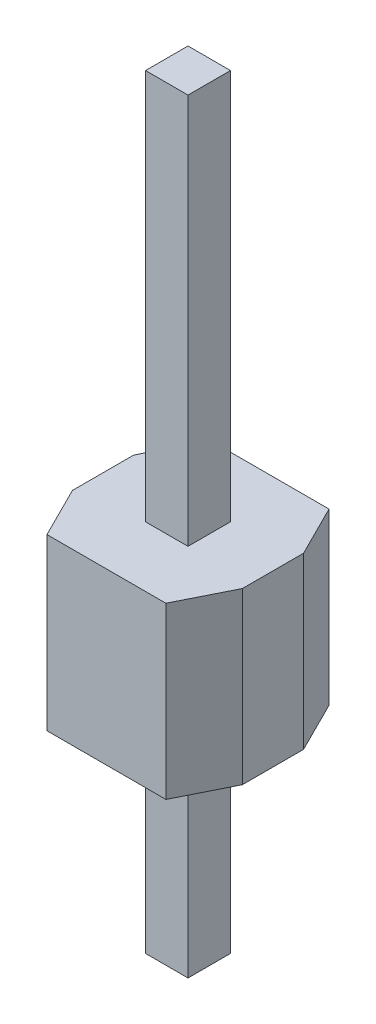
ISO-10303-21;
HEADER;
FILE_DESCRIPTION(('STEP AP214'),'2;1');
FILE_NAME('part.step','',(''),(''),'','','');
FILE_SCHEMA(('AUTOMOTIVE_DESIGN { 1 0 10303 214 1 1 1 1 }'));
ENDSEC;
DATA;
#1=APPLICATION_CONTEXT('core data for automotive mechanical design processes');
#2=APPLICATION_PROTOCOL_DEFINITION('international standard','automotive_design',2000,#1);
#3=PRODUCT_CONTEXT('',#1,'mechanical');
#4=PRODUCT('Part','Part','',(#3));
#5=PRODUCT_RELATED_PRODUCT_CATEGORY('part','',(#4));
#6=PRODUCT_DEFINITION_FORMATION('','',#4);
#7=PRODUCT_DEFINITION_CONTEXT('part definition',#1,'design');
#8=PRODUCT_DEFINITION('design','',#6,#7);
#9=PRODUCT_DEFINITION_SHAPE('','',#8);
#10=(LENGTH_UNIT() NAMED_UNIT(*) SI_UNIT(.MILLI.,.METRE.));
#11=(NAMED_UNIT(*) PLANE_ANGLE_UNIT() SI_UNIT($,.RADIAN.));
#12=(NAMED_UNIT(*) SI_UNIT($,.STERADIAN.) SOLID_ANGLE_UNIT());
#13=UNCERTAINTY_MEASURE_WITH_UNIT(LENGTH_MEASURE(1.E-05),#10,'distance_accuracy_value','');
#14=(GEOMETRIC_REPRESENTATION_CONTEXT(3) GLOBAL_UNCERTAINTY_ASSIGNED_CONTEXT((#13)) GLOBAL_UNIT_ASSIGNED_CONTEXT((#10,
#11,#12)) REPRESENTATION_CONTEXT('',''));
#15=CARTESIAN_POINT('',(0.,0.,0.));
#16=DIRECTION('',(0.,0.,1.));
#17=DIRECTION('',(1.,0.,0.));
#18=AXIS2_PLACEMENT_3D('',#15,#16,#17);
#19=CARTESIAN_POINT('',(0.,0.,0.));
#20=DIRECTION('',(0.,1.,0.));
#21=DIRECTION('',(0.,0.,1.));
#22=AXIS2_PLACEMENT_3D('',#19,#20,#21);
#23=PLANE('',#22);
#24=DIRECTION('',(1.,0.,0.));
#25=VECTOR('',#24,1.);
#26=CARTESIAN_POINT('',(0.381,0.,0.));
#27=LINE('',#26,#25);
#28=CARTESIAN_POINT('',(0.381,0.,0.));
#29=VERTEX_POINT('',#28);
#30=CARTESIAN_POINT('',(2.159,0.,0.));
#31=VERTEX_POINT('',#30);
#32=EDGE_CURVE('E203',#29,#31,#27,.T.);
#33=ORIENTED_EDGE('',*,*,#32,.F.);
#34=DIRECTION('',(0.447213595499958,0.,0.894427190999916));
#35=VECTOR('',#34,1.);
#36=CARTESIAN_POINT('',(0.381,0.,0.));
#37=LINE('',#36,#35);
#38=CARTESIAN_POINT('',(0.,0.,-0.762));
#39=VERTEX_POINT('',#38);
#40=EDGE_CURVE('E208',#39,#29,#37,.T.);
#41=ORIENTED_EDGE('',*,*,#40,.F.);
#42=DIRECTION('',(0.,0.,1.));
#43=VECTOR('',#42,1.);
#44=CARTESIAN_POINT('',(0.,0.,-0.762));
#45=LINE('',#44,#43);
#46=CARTESIAN_POINT('',(0.,0.,-1.6764));
#47=VERTEX_POINT('',#46);
#48=EDGE_CURVE('E235',#47,#39,#45,.T.);
#49=ORIENTED_EDGE('',*,*,#48,.F.);
#50=DIRECTION('',(-0.447213595499958,0.,0.894427190999916));
#51=VECTOR('',#50,1.);
#52=CARTESIAN_POINT('',(0.,0.,-1.6764));
#53=LINE('',#52,#51);
#54=CARTESIAN_POINT('',(0.381,0.,-2.4384));
#55=VERTEX_POINT('',#54);
#56=EDGE_CURVE('E233',#55,#47,#53,.T.);
#57=ORIENTED_EDGE('',*,*,#56,.F.);
#58=DIRECTION('',(-1.,0.,0.));
#59=VECTOR('',#58,1.);
#60=CARTESIAN_POINT('',(0.381,0.,-2.4384));
#61=LINE('',#60,#59);
#62=CARTESIAN_POINT('',(2.159,0.,-2.4384));
#63=VERTEX_POINT('',#62);
#64=EDGE_CURVE('E231',#63,#55,#61,.T.);
#65=ORIENTED_EDGE('',*,*,#64,.F.);
#66=DIRECTION('',(-0.447213595499958,0.,-0.894427190999916));
#67=VECTOR('',#66,1.);
#68=CARTESIAN_POINT('',(2.54,0.,-1.6764));
#69=LINE('',#68,#67);
#70=CARTESIAN_POINT('',(2.54,0.,-1.6764));
#71=VERTEX_POINT('',#70);
#72=EDGE_CURVE('E229',#71,#63,#69,.T.);
#73=ORIENTED_EDGE('',*,*,#72,.F.);
#74=DIRECTION('',(0.,0.,-1.));
#75=VECTOR('',#74,1.);
#76=CARTESIAN_POINT('',(2.54,0.,-0.762));
#77=LINE('',#76,#75);
#78=CARTESIAN_POINT('',(2.54,0.,-0.762));
#79=VERTEX_POINT('',#78);
#80=EDGE_CURVE('E227',#79,#71,#77,.T.);
#81=ORIENTED_EDGE('',*,*,#80,.F.);
#82=DIRECTION('',(0.447213595499958,0.,-0.894427190999916));
#83=VECTOR('',#82,1.);
#84=CARTESIAN_POINT('',(2.159,0.,0.));
#85=LINE('',#84,#83);
#86=EDGE_CURVE('E225',#31,#79,#85,.T.);
#87=ORIENTED_EDGE('',*,*,#86,.F.);
#88=EDGE_LOOP('',(#33,#41,#49,#57,#65,#73,#81,#87));
#89=FACE_BOUND('',#88,.T.);
#90=DIRECTION('',(0.,0.,1.));
#91=VECTOR('',#90,1.);
#92=CARTESIAN_POINT('',(1.5875,0.,-0.9017));
#93=LINE('',#92,#91);
#94=CARTESIAN_POINT('',(1.5875,0.,-1.5367));
#95=VERTEX_POINT('',#94);
#96=CARTESIAN_POINT('',(1.5875,0.,-0.9017));
#97=VERTEX_POINT('',#96);
#98=EDGE_CURVE('E168',#95,#97,#93,.T.);
#99=ORIENTED_EDGE('',*,*,#98,.F.);
#100=DIRECTION('',(1.,0.,0.));
#101=VECTOR('',#100,1.);
#102=CARTESIAN_POINT('',(1.5875,0.,-1.5367));
#103=LINE('',#102,#101);
#104=CARTESIAN_POINT('',(0.9525,0.,-1.5367));
#105=VERTEX_POINT('',#104);
#106=EDGE_CURVE('E165',#105,#95,#103,.T.);
#107=ORIENTED_EDGE('',*,*,#106,.F.);
#108=DIRECTION('',(0.,0.,-1.));
#109=VECTOR('',#108,1.);
#110=CARTESIAN_POINT('',(0.9525,0.,-0.9017));
#111=LINE('',#110,#109);
#112=CARTESIAN_POINT('',(0.9525,0.,-0.9017));
#113=VERTEX_POINT('',#112);
#114=EDGE_CURVE('E55',#113,#105,#111,.T.);
#115=ORIENTED_EDGE('',*,*,#114,.F.);
#116=DIRECTION('',(-1.,0.,0.));
#117=VECTOR('',#116,1.);
#118=CARTESIAN_POINT('',(1.5875,0.,-0.9017));
#119=LINE('',#118,#117);
#120=EDGE_CURVE('E50',#97,#113,#119,.T.);
#121=ORIENTED_EDGE('',*,*,#120,.F.);
#122=EDGE_LOOP('',(#99,#107,#115,#121));
#123=FACE_BOUND('',#122,.T.);
#124=ADVANCED_FACE('F35',(#89,#123),#23,.F.);
#125=CARTESIAN_POINT('',(0.,2.54,0.));
#126=DIRECTION('',(0.,1.,0.));
#127=DIRECTION('',(0.,0.,1.));
#128=AXIS2_PLACEMENT_3D('',#125,#126,#127);
#129=PLANE('',#128);
#130=DIRECTION('',(1.,0.,0.));
#131=VECTOR('',#130,1.);
#132=CARTESIAN_POINT('',(0.381,2.54,0.));
#133=LINE('',#132,#131);
#134=CARTESIAN_POINT('',(0.381,2.54,0.));
#135=VERTEX_POINT('',#134);
#136=CARTESIAN_POINT('',(2.159,2.54,0.));
#137=VERTEX_POINT('',#136);
#138=EDGE_CURVE('E204',#135,#137,#133,.T.);
#139=ORIENTED_EDGE('',*,*,#138,.T.);
#140=DIRECTION('',(0.447213595499958,0.,-0.894427190999916));
#141=VECTOR('',#140,1.);
#142=CARTESIAN_POINT('',(2.159,2.54,0.));
#143=LINE('',#142,#141);
#144=CARTESIAN_POINT('',(2.54,2.54,-0.762));
#145=VERTEX_POINT('',#144);
#146=EDGE_CURVE('E207',#137,#145,#143,.T.);
#147=ORIENTED_EDGE('',*,*,#146,.T.);
#148=DIRECTION('',(0.,0.,-1.));
#149=VECTOR('',#148,1.);
#150=CARTESIAN_POINT('',(2.54,2.54,-0.762));
#151=LINE('',#150,#149);
#152=CARTESIAN_POINT('',(2.54,2.54,-1.6764));
#153=VERTEX_POINT('',#152);
#154=EDGE_CURVE('E210',#145,#153,#151,.T.);
#155=ORIENTED_EDGE('',*,*,#154,.T.);
#156=DIRECTION('',(-0.447213595499958,0.,-0.894427190999916));
#157=VECTOR('',#156,1.);
#158=CARTESIAN_POINT('',(2.54,2.54,-1.6764));
#159=LINE('',#158,#157);
#160=CARTESIAN_POINT('',(2.159,2.54,-2.4384));
#161=VERTEX_POINT('',#160);
#162=EDGE_CURVE('E212',#153,#161,#159,.T.);
#163=ORIENTED_EDGE('',*,*,#162,.T.);
#164=DIRECTION('',(-1.,0.,0.));
#165=VECTOR('',#164,1.);
#166=CARTESIAN_POINT('',(0.381,2.54,-2.4384));
#167=LINE('',#166,#165);
#168=CARTESIAN_POINT('',(0.381,2.54,-2.4384));
#169=VERTEX_POINT('',#168);
#170=EDGE_CURVE('E214',#161,#169,#167,.T.);
#171=ORIENTED_EDGE('',*,*,#170,.T.);
#172=DIRECTION('',(-0.447213595499958,0.,0.894427190999916));
#173=VECTOR('',#172,1.);
#174=CARTESIAN_POINT('',(0.,2.54,-1.6764));
#175=LINE('',#174,#173);
#176=CARTESIAN_POINT('',(0.,2.54,-1.6764));
#177=VERTEX_POINT('',#176);
#178=EDGE_CURVE('E216',#169,#177,#175,.T.);
#179=ORIENTED_EDGE('',*,*,#178,.T.);
#180=DIRECTION('',(0.,0.,1.));
#181=VECTOR('',#180,1.);
#182=CARTESIAN_POINT('',(0.,2.54,-0.762));
#183=LINE('',#182,#181);
#184=CARTESIAN_POINT('',(0.,2.54,-0.762));
#185=VERTEX_POINT('',#184);
#186=EDGE_CURVE('E218',#177,#185,#183,.T.);
#187=ORIENTED_EDGE('',*,*,#186,.T.);
#188=DIRECTION('',(0.447213595499958,0.,0.894427190999916));
#189=VECTOR('',#188,1.);
#190=CARTESIAN_POINT('',(0.381,2.54,0.));
#191=LINE('',#190,#189);
#192=EDGE_CURVE('E220',#185,#135,#191,.T.);
#193=ORIENTED_EDGE('',*,*,#192,.T.);
#194=EDGE_LOOP('',(#139,#147,#155,#163,#171,#179,#187,#193));
#195=FACE_BOUND('',#194,.T.);
#196=DIRECTION('',(1.,0.,0.));
#197=VECTOR('',#196,1.);
#198=CARTESIAN_POINT('',(0.9525,2.54,-0.9017));
#199=LINE('',#198,#197);
#200=CARTESIAN_POINT('',(0.9525,2.54,-0.9017));
#201=VERTEX_POINT('',#200);
#202=CARTESIAN_POINT('',(1.5875,2.54,-0.9017));
#203=VERTEX_POINT('',#202);
#204=EDGE_CURVE('E172',#201,#203,#199,.T.);
#205=ORIENTED_EDGE('',*,*,#204,.F.);
#206=DIRECTION('',(0.,0.,1.));
#207=VECTOR('',#206,1.);
#208=CARTESIAN_POINT('',(0.9525,2.54,-1.5367));
#209=LINE('',#208,#207);
#210=CARTESIAN_POINT('',(0.9525,2.54,-1.5367));
#211=VERTEX_POINT('',#210);
#212=EDGE_CURVE('E169',#211,#201,#209,.T.);
#213=ORIENTED_EDGE('',*,*,#212,.F.);
#214=DIRECTION('',(-1.,0.,0.));
#215=VECTOR('',#214,1.);
#216=CARTESIAN_POINT('',(0.9525,2.54,-1.5367));
#217=LINE('',#216,#215);
#218=CARTESIAN_POINT('',(1.5875,2.54,-1.5367));
#219=VERTEX_POINT('',#218);
#220=EDGE_CURVE('E182',#219,#211,#217,.T.);
#221=ORIENTED_EDGE('',*,*,#220,.F.);
#222=DIRECTION('',(0.,0.,-1.));
#223=VECTOR('',#222,1.);
#224=CARTESIAN_POINT('',(1.5875,2.54,-1.5367));
#225=LINE('',#224,#223);
#226=EDGE_CURVE('E190',#203,#219,#225,.T.);
#227=ORIENTED_EDGE('',*,*,#226,.F.);
#228=EDGE_LOOP('',(#205,#213,#221,#227));
#229=FACE_BOUND('',#228,.T.);
#230=ADVANCED_FACE('F277',(#195,#229),#129,.T.);
#231=CARTESIAN_POINT('',(0.381,2.54,0.));
#232=DIRECTION('',(0.,0.,-1.));
#233=DIRECTION('',(-1.,0.,0.));
#234=AXIS2_PLACEMENT_3D('',#231,#232,#233);
#235=PLANE('',#234);
#236=ORIENTED_EDGE('',*,*,#32,.T.);
#237=DIRECTION('',(0.,-1.,0.));
#238=VECTOR('',#237,1.);
#239=CARTESIAN_POINT('',(2.159,2.54,0.));
#240=LINE('',#239,#238);
#241=EDGE_CURVE('E11',#137,#31,#240,.T.);
#242=ORIENTED_EDGE('',*,*,#241,.F.);
#243=ORIENTED_EDGE('',*,*,#138,.F.);
#244=DIRECTION('',(0.,-1.,0.));
#245=VECTOR('',#244,1.);
#246=CARTESIAN_POINT('',(0.381,2.54,0.));
#247=LINE('',#246,#245);
#248=EDGE_CURVE('E222',#135,#29,#247,.T.);
#249=ORIENTED_EDGE('',*,*,#248,.T.);
#250=EDGE_LOOP('',(#236,#242,#243,#249));
#251=FACE_BOUND('',#250,.T.);
#252=ADVANCED_FACE('F37',(#251),#235,.F.);
#253=CARTESIAN_POINT('',(2.159,2.54,0.));
#254=DIRECTION('',(-0.894427190999916,0.,-0.447213595499958));
#255=DIRECTION('',(-0.447213595499958,0.,0.894427190999916));
#256=AXIS2_PLACEMENT_3D('',#253,#254,#255);
#257=PLANE('',#256);
#258=ORIENTED_EDGE('',*,*,#86,.T.);
#259=DIRECTION('',(0.,-1.,0.));
#260=VECTOR('',#259,1.);
#261=CARTESIAN_POINT('',(2.54,2.54,-0.762));
#262=LINE('',#261,#260);
#263=EDGE_CURVE('E43',#145,#79,#262,.T.);
#264=ORIENTED_EDGE('',*,*,#263,.F.);
#265=ORIENTED_EDGE('',*,*,#146,.F.);
#266=ORIENTED_EDGE('',*,*,#241,.T.);
#267=EDGE_LOOP('',(#258,#264,#265,#266));
#268=FACE_BOUND('',#267,.T.);
#269=ADVANCED_FACE('F282',(#268),#257,.F.);
#270=CARTESIAN_POINT('',(2.54,2.54,-0.762));
#271=DIRECTION('',(-1.,0.,0.));
#272=DIRECTION('',(0.,0.,1.));
#273=AXIS2_PLACEMENT_3D('',#270,#271,#272);
#274=PLANE('',#273);
#275=ORIENTED_EDGE('',*,*,#80,.T.);
#276=DIRECTION('',(0.,-1.,0.));
#277=VECTOR('',#276,1.);
#278=CARTESIAN_POINT('',(2.54,2.54,-1.6764));
#279=LINE('',#278,#277);
#280=EDGE_CURVE('E252',#153,#71,#279,.T.);
#281=ORIENTED_EDGE('',*,*,#280,.F.);
#282=ORIENTED_EDGE('',*,*,#154,.F.);
#283=ORIENTED_EDGE('',*,*,#263,.T.);
#284=EDGE_LOOP('',(#275,#281,#282,#283));
#285=FACE_BOUND('',#284,.T.);
#286=ADVANCED_FACE('F259',(#285),#274,.F.);
#287=CARTESIAN_POINT('',(2.54,2.54,-1.6764));
#288=DIRECTION('',(-0.894427190999916,0.,0.447213595499958));
#289=DIRECTION('',(0.447213595499958,0.,0.894427190999916));
#290=AXIS2_PLACEMENT_3D('',#287,#288,#289);
#291=PLANE('',#290);
#292=ORIENTED_EDGE('',*,*,#72,.T.);
#293=DIRECTION('',(0.,-1.,0.));
#294=VECTOR('',#293,1.);
#295=CARTESIAN_POINT('',(2.159,2.54,-2.4384));
#296=LINE('',#295,#294);
#297=EDGE_CURVE('E249',#161,#63,#296,.T.);
#298=ORIENTED_EDGE('',*,*,#297,.F.);
#299=ORIENTED_EDGE('',*,*,#162,.F.);
#300=ORIENTED_EDGE('',*,*,#280,.T.);
#301=EDGE_LOOP('',(#292,#298,#299,#300));
#302=FACE_BOUND('',#301,.T.);
#303=ADVANCED_FACE('F269',(#302),#291,.F.);
#304=CARTESIAN_POINT('',(0.381,2.54,-2.4384));
#305=DIRECTION('',(0.,0.,1.));
#306=DIRECTION('',(1.,0.,0.));
#307=AXIS2_PLACEMENT_3D('',#304,#305,#306);
#308=PLANE('',#307);
#309=ORIENTED_EDGE('',*,*,#64,.T.);
#310=DIRECTION('',(0.,-1.,0.));
#311=VECTOR('',#310,1.);
#312=CARTESIAN_POINT('',(0.381,2.54,-2.4384));
#313=LINE('',#312,#311);
#314=EDGE_CURVE('E246',#169,#55,#313,.T.);
#315=ORIENTED_EDGE('',*,*,#314,.F.);
#316=ORIENTED_EDGE('',*,*,#170,.F.);
#317=ORIENTED_EDGE('',*,*,#297,.T.);
#318=EDGE_LOOP('',(#309,#315,#316,#317));
#319=FACE_BOUND('',#318,.T.);
#320=ADVANCED_FACE('F273',(#319),#308,.F.);
#321=CARTESIAN_POINT('',(0.,2.54,-1.6764));
#322=DIRECTION('',(0.894427190999916,0.,0.447213595499958));
#323=DIRECTION('',(0.447213595499958,0.,-0.894427190999916));
#324=AXIS2_PLACEMENT_3D('',#321,#322,#323);
#325=PLANE('',#324);
#326=ORIENTED_EDGE('',*,*,#56,.T.);
#327=DIRECTION('',(0.,-1.,0.));
#328=VECTOR('',#327,1.);
#329=CARTESIAN_POINT('',(0.,2.54,-1.6764));
#330=LINE('',#329,#328);
#331=EDGE_CURVE('E243',#177,#47,#330,.T.);
#332=ORIENTED_EDGE('',*,*,#331,.F.);
#333=ORIENTED_EDGE('',*,*,#178,.F.);
#334=ORIENTED_EDGE('',*,*,#314,.T.);
#335=EDGE_LOOP('',(#326,#332,#333,#334));
#336=FACE_BOUND('',#335,.T.);
#337=ADVANCED_FACE('F295',(#336),#325,.F.);
#338=CARTESIAN_POINT('',(0.,2.54,-0.762));
#339=DIRECTION('',(1.,0.,0.));
#340=DIRECTION('',(0.,0.,-1.));
#341=AXIS2_PLACEMENT_3D('',#338,#339,#340);
#342=PLANE('',#341);
#343=ORIENTED_EDGE('',*,*,#48,.T.);
#344=DIRECTION('',(0.,-1.,0.));
#345=VECTOR('',#344,1.);
#346=CARTESIAN_POINT('',(0.,2.54,-0.762));
#347=LINE('',#346,#345);
#348=EDGE_CURVE('E240',#185,#39,#347,.T.);
#349=ORIENTED_EDGE('',*,*,#348,.F.);
#350=ORIENTED_EDGE('',*,*,#186,.F.);
#351=ORIENTED_EDGE('',*,*,#331,.T.);
#352=EDGE_LOOP('',(#343,#349,#350,#351));
#353=FACE_BOUND('',#352,.T.);
#354=ADVANCED_FACE('F293',(#353),#342,.F.);
#355=CARTESIAN_POINT('',(0.381,2.54,0.));
#356=DIRECTION('',(0.894427190999916,0.,-0.447213595499958));
#357=DIRECTION('',(-0.447213595499958,0.,-0.894427190999916));
#358=AXIS2_PLACEMENT_3D('',#355,#356,#357);
#359=PLANE('',#358);
#360=ORIENTED_EDGE('',*,*,#40,.T.);
#361=ORIENTED_EDGE('',*,*,#248,.F.);
#362=ORIENTED_EDGE('',*,*,#192,.F.);
#363=ORIENTED_EDGE('',*,*,#348,.T.);
#364=EDGE_LOOP('',(#360,#361,#362,#363));
#365=FACE_BOUND('',#364,.T.);
#366=ADVANCED_FACE('F288',(#365),#359,.F.);
#367=CARTESIAN_POINT('',(0.9525,8.382,-1.5367));
#368=DIRECTION('',(1.,0.,0.));
#369=DIRECTION('',(0.,0.,-1.));
#370=AXIS2_PLACEMENT_3D('',#367,#368,#369);
#371=PLANE('',#370);
#372=ORIENTED_EDGE('',*,*,#212,.T.);
#373=DIRECTION('',(0.,-1.,0.));
#374=VECTOR('',#373,1.);
#375=CARTESIAN_POINT('',(0.9525,8.382,-0.9017));
#376=LINE('',#375,#374);
#377=CARTESIAN_POINT('',(0.9525,8.382,-0.9017));
#378=VERTEX_POINT('',#377);
#379=EDGE_CURVE('E201',#378,#201,#376,.T.);
#380=ORIENTED_EDGE('',*,*,#379,.F.);
#381=DIRECTION('',(0.,0.,1.));
#382=VECTOR('',#381,1.);
#383=CARTESIAN_POINT('',(0.9525,8.382,-1.5367));
#384=LINE('',#383,#382);
#385=CARTESIAN_POINT('',(0.9525,8.382,-1.5367));
#386=VERTEX_POINT('',#385);
#387=EDGE_CURVE('E178',#386,#378,#384,.T.);
#388=ORIENTED_EDGE('',*,*,#387,.F.);
#389=DIRECTION('',(0.,-1.,0.));
#390=VECTOR('',#389,1.);
#391=CARTESIAN_POINT('',(0.9525,8.382,-1.5367));
#392=LINE('',#391,#390);
#393=EDGE_CURVE('E187',#386,#211,#392,.T.);
#394=ORIENTED_EDGE('',*,*,#393,.T.);
#395=EDGE_LOOP('',(#372,#380,#388,#394));
#396=FACE_BOUND('',#395,.T.);
#397=ADVANCED_FACE('F313',(#396),#371,.F.);
#398=CARTESIAN_POINT('',(0.9525,8.382,-0.9017));
#399=DIRECTION('',(0.,0.,-1.));
#400=DIRECTION('',(-1.,0.,0.));
#401=AXIS2_PLACEMENT_3D('',#398,#399,#400);
#402=PLANE('',#401);
#403=ORIENTED_EDGE('',*,*,#204,.T.);
#404=DIRECTION('',(0.,-1.,0.));
#405=VECTOR('',#404,1.);
#406=CARTESIAN_POINT('',(1.5875,8.382,-0.9017));
#407=LINE('',#406,#405);
#408=CARTESIAN_POINT('',(1.5875,8.382,-0.9017));
#409=VERTEX_POINT('',#408);
#410=EDGE_CURVE('E198',#409,#203,#407,.T.);
#411=ORIENTED_EDGE('',*,*,#410,.F.);
#412=DIRECTION('',(1.,0.,0.));
#413=VECTOR('',#412,1.);
#414=CARTESIAN_POINT('',(0.9525,8.382,-0.9017));
#415=LINE('',#414,#413);
#416=EDGE_CURVE('E181',#378,#409,#415,.T.);
#417=ORIENTED_EDGE('',*,*,#416,.F.);
#418=ORIENTED_EDGE('',*,*,#379,.T.);
#419=EDGE_LOOP('',(#403,#411,#417,#418));
#420=FACE_BOUND('',#419,.T.);
#421=ADVANCED_FACE('F317',(#420),#402,.F.);
#422=CARTESIAN_POINT('',(1.5875,8.382,-1.5367));
#423=DIRECTION('',(-1.,0.,0.));
#424=DIRECTION('',(0.,0.,1.));
#425=AXIS2_PLACEMENT_3D('',#422,#423,#424);
#426=PLANE('',#425);
#427=ORIENTED_EDGE('',*,*,#226,.T.);
#428=DIRECTION('',(0.,-1.,0.));
#429=VECTOR('',#428,1.);
#430=CARTESIAN_POINT('',(1.5875,8.382,-1.5367));
#431=LINE('',#430,#429);
#432=CARTESIAN_POINT('',(1.5875,8.382,-1.5367));
#433=VERTEX_POINT('',#432);
#434=EDGE_CURVE('E196',#433,#219,#431,.T.);
#435=ORIENTED_EDGE('',*,*,#434,.F.);
#436=DIRECTION('',(0.,0.,-1.));
#437=VECTOR('',#436,1.);
#438=CARTESIAN_POINT('',(1.5875,8.382,-1.5367));
#439=LINE('',#438,#437);
#440=EDGE_CURVE('E184',#409,#433,#439,.T.);
#441=ORIENTED_EDGE('',*,*,#440,.F.);
#442=ORIENTED_EDGE('',*,*,#410,.T.);
#443=EDGE_LOOP('',(#427,#435,#441,#442));
#444=FACE_BOUND('',#443,.T.);
#445=ADVANCED_FACE('F322',(#444),#426,.F.);
#446=CARTESIAN_POINT('',(0.9525,8.382,-1.5367));
#447=DIRECTION('',(0.,0.,1.));
#448=DIRECTION('',(1.,0.,0.));
#449=AXIS2_PLACEMENT_3D('',#446,#447,#448);
#450=PLANE('',#449);
#451=ORIENTED_EDGE('',*,*,#220,.T.);
#452=ORIENTED_EDGE('',*,*,#393,.F.);
#453=DIRECTION('',(-1.,0.,0.));
#454=VECTOR('',#453,1.);
#455=CARTESIAN_POINT('',(0.9525,8.382,-1.5367));
#456=LINE('',#455,#454);
#457=EDGE_CURVE('E186',#433,#386,#456,.T.);
#458=ORIENTED_EDGE('',*,*,#457,.F.);
#459=ORIENTED_EDGE('',*,*,#434,.T.);
#460=EDGE_LOOP('',(#451,#452,#458,#459));
#461=FACE_BOUND('',#460,.T.);
#462=ADVANCED_FACE('F328',(#461),#450,.F.);
#463=CARTESIAN_POINT('',(0.,8.382,0.));
#464=DIRECTION('',(0.,1.,0.));
#465=DIRECTION('',(0.,0.,1.));
#466=AXIS2_PLACEMENT_3D('',#463,#464,#465);
#467=PLANE('',#466);
#468=ORIENTED_EDGE('',*,*,#387,.T.);
#469=ORIENTED_EDGE('',*,*,#416,.T.);
#470=ORIENTED_EDGE('',*,*,#440,.T.);
#471=ORIENTED_EDGE('',*,*,#457,.T.);
#472=EDGE_LOOP('',(#468,#469,#470,#471));
#473=FACE_BOUND('',#472,.T.);
#474=ADVANCED_FACE('F332',(#473),#467,.T.);
#475=CARTESIAN_POINT('',(1.5875,-3.048,-0.9017));
#476=DIRECTION('',(-1.,0.,0.));
#477=DIRECTION('',(0.,0.,1.));
#478=AXIS2_PLACEMENT_3D('',#475,#476,#477);
#479=PLANE('',#478);
#480=ORIENTED_EDGE('',*,*,#98,.T.);
#481=DIRECTION('',(0.,1.,0.));
#482=VECTOR('',#481,1.);
#483=CARTESIAN_POINT('',(1.5875,-3.048,-0.9017));
#484=LINE('',#483,#482);
#485=CARTESIAN_POINT('',(1.5875,-3.048,-0.9017));
#486=VERTEX_POINT('',#485);
#487=EDGE_CURVE('E149',#486,#97,#484,.T.);
#488=ORIENTED_EDGE('',*,*,#487,.F.);
#489=DIRECTION('',(0.,0.,1.));
#490=VECTOR('',#489,1.);
#491=CARTESIAN_POINT('',(1.5875,-3.048,-0.9017));
#492=LINE('',#491,#490);
#493=CARTESIAN_POINT('',(1.5875,-3.048,-1.5367));
#494=VERTEX_POINT('',#493);
#495=EDGE_CURVE('E156',#494,#486,#492,.T.);
#496=ORIENTED_EDGE('',*,*,#495,.F.);
#497=DIRECTION('',(0.,1.,0.));
#498=VECTOR('',#497,1.);
#499=CARTESIAN_POINT('',(1.5875,-3.048,-1.5367));
#500=LINE('',#499,#498);
#501=EDGE_CURVE('E490',#494,#95,#500,.T.);
#502=ORIENTED_EDGE('',*,*,#501,.T.);
#503=EDGE_LOOP('',(#480,#488,#496,#502));
#504=FACE_BOUND('',#503,.T.);
#505=ADVANCED_FACE('F167',(#504),#479,.F.);
#506=CARTESIAN_POINT('',(1.5875,-3.048,-0.9017));
#507=DIRECTION('',(0.,0.,-1.));
#508=DIRECTION('',(-1.,0.,0.));
#509=AXIS2_PLACEMENT_3D('',#506,#507,#508);
#510=PLANE('',#509);
#511=ORIENTED_EDGE('',*,*,#120,.T.);
#512=DIRECTION('',(0.,1.,0.));
#513=VECTOR('',#512,1.);
#514=CARTESIAN_POINT('',(0.9525,-3.048,-0.9017));
#515=LINE('',#514,#513);
#516=CARTESIAN_POINT('',(0.9525,-3.048,-0.9017));
#517=VERTEX_POINT('',#516);
#518=EDGE_CURVE('E152',#517,#113,#515,.T.);
#519=ORIENTED_EDGE('',*,*,#518,.F.);
#520=DIRECTION('',(-1.,0.,0.));
#521=VECTOR('',#520,1.);
#522=CARTESIAN_POINT('',(1.5875,-3.048,-0.9017));
#523=LINE('',#522,#521);
#524=EDGE_CURVE('E145',#486,#517,#523,.T.);
#525=ORIENTED_EDGE('',*,*,#524,.F.);
#526=ORIENTED_EDGE('',*,*,#487,.T.);
#527=EDGE_LOOP('',(#511,#519,#525,#526));
#528=FACE_BOUND('',#527,.T.);
#529=ADVANCED_FACE('F147',(#528),#510,.F.);
#530=CARTESIAN_POINT('',(0.9525,-3.048,-0.9017));
#531=DIRECTION('',(1.,0.,0.));
#532=DIRECTION('',(0.,0.,-1.));
#533=AXIS2_PLACEMENT_3D('',#530,#531,#532);
#534=PLANE('',#533);
#535=ORIENTED_EDGE('',*,*,#114,.T.);
#536=DIRECTION('',(0.,1.,0.));
#537=VECTOR('',#536,1.);
#538=CARTESIAN_POINT('',(0.9525,-3.048,-1.5367));
#539=LINE('',#538,#537);
#540=CARTESIAN_POINT('',(0.9525,-3.048,-1.5367));
#541=VERTEX_POINT('',#540);
#542=EDGE_CURVE('E174',#541,#105,#539,.T.);
#543=ORIENTED_EDGE('',*,*,#542,.F.);
#544=DIRECTION('',(0.,0.,-1.));
#545=VECTOR('',#544,1.);
#546=CARTESIAN_POINT('',(0.9525,-3.048,-0.9017));
#547=LINE('',#546,#545);
#548=EDGE_CURVE('E155',#517,#541,#547,.T.);
#549=ORIENTED_EDGE('',*,*,#548,.F.);
#550=ORIENTED_EDGE('',*,*,#518,.T.);
#551=EDGE_LOOP('',(#535,#543,#549,#550));
#552=FACE_BOUND('',#551,.T.);
#553=ADVANCED_FACE('F341',(#552),#534,.F.);
#554=CARTESIAN_POINT('',(1.5875,-3.048,-1.5367));
#555=DIRECTION('',(0.,0.,1.));
#556=DIRECTION('',(1.,0.,0.));
#557=AXIS2_PLACEMENT_3D('',#554,#555,#556);
#558=PLANE('',#557);
#559=ORIENTED_EDGE('',*,*,#106,.T.);
#560=ORIENTED_EDGE('',*,*,#501,.F.);
#561=DIRECTION('',(1.,0.,0.));
#562=VECTOR('',#561,1.);
#563=CARTESIAN_POINT('',(1.5875,-3.048,-1.5367));
#564=LINE('',#563,#562);
#565=EDGE_CURVE('E161',#541,#494,#564,.T.);
#566=ORIENTED_EDGE('',*,*,#565,.F.);
#567=ORIENTED_EDGE('',*,*,#542,.T.);
#568=EDGE_LOOP('',(#559,#560,#566,#567));
#569=FACE_BOUND('',#568,.T.);
#570=ADVANCED_FACE('F344',(#569),#558,.F.);
#571=CARTESIAN_POINT('',(0.,-3.048,0.));
#572=DIRECTION('',(0.,1.,0.));
#573=DIRECTION('',(0.,0.,1.));
#574=AXIS2_PLACEMENT_3D('',#571,#572,#573);
#575=PLANE('',#574);
#576=ORIENTED_EDGE('',*,*,#495,.T.);
#577=ORIENTED_EDGE('',*,*,#524,.T.);
#578=ORIENTED_EDGE('',*,*,#548,.T.);
#579=ORIENTED_EDGE('',*,*,#565,.T.);
#580=EDGE_LOOP('',(#576,#577,#578,#579));
#581=FACE_BOUND('',#580,.T.);
#582=ADVANCED_FACE('F159',(#581),#575,.F.);
#583=CLOSED_SHELL('',(#124,#230,#252,#269,#286,#303,#320,#337,#354,#366,#397,#421,#445,#462,
#474,#505,#529,#553,#570,#582));
#584=MANIFOLD_SOLID_BREP('B2',#583);
#585=ADVANCED_BREP_SHAPE_REPRESENTATION('',(#18,#584),#14);
#586=SHAPE_DEFINITION_REPRESENTATION(#9,#585);
ENDSEC;
END-ISO-10303-21;
